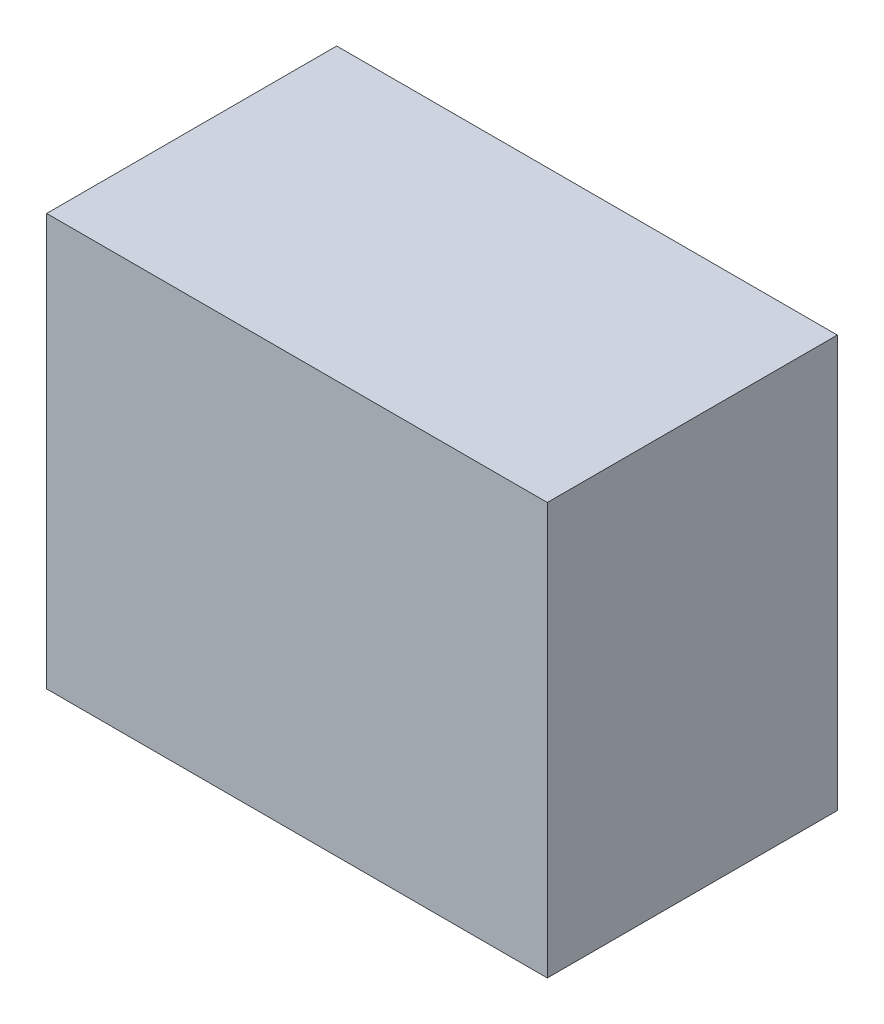
ISO-10303-21;
HEADER;
FILE_DESCRIPTION(('STEP AP214'),'2;1');
FILE_NAME('part.step','',(''),(''),'','','');
FILE_SCHEMA(('AUTOMOTIVE_DESIGN { 1 0 10303 214 1 1 1 1 }'));
ENDSEC;
DATA;
#1=APPLICATION_CONTEXT('core data for automotive mechanical design processes');
#2=APPLICATION_PROTOCOL_DEFINITION('international standard','automotive_design',2000,#1);
#3=PRODUCT_CONTEXT('',#1,'mechanical');
#4=PRODUCT('Part','Part','',(#3));
#5=PRODUCT_RELATED_PRODUCT_CATEGORY('part','',(#4));
#6=PRODUCT_DEFINITION_FORMATION('','',#4);
#7=PRODUCT_DEFINITION_CONTEXT('part definition',#1,'design');
#8=PRODUCT_DEFINITION('design','',#6,#7);
#9=PRODUCT_DEFINITION_SHAPE('','',#8);
#10=(LENGTH_UNIT() NAMED_UNIT(*) SI_UNIT(.MILLI.,.METRE.));
#11=(NAMED_UNIT(*) PLANE_ANGLE_UNIT() SI_UNIT($,.RADIAN.));
#12=(NAMED_UNIT(*) SI_UNIT($,.STERADIAN.) SOLID_ANGLE_UNIT());
#13=UNCERTAINTY_MEASURE_WITH_UNIT(LENGTH_MEASURE(1.E-05),#10,'distance_accuracy_value','');
#14=(GEOMETRIC_REPRESENTATION_CONTEXT(3) GLOBAL_UNCERTAINTY_ASSIGNED_CONTEXT((#13)) GLOBAL_UNIT_ASSIGNED_CONTEXT((#10,
#11,#12)) REPRESENTATION_CONTEXT('',''));
#15=CARTESIAN_POINT('',(0.,0.,0.));
#16=DIRECTION('',(0.,0.,1.));
#17=DIRECTION('',(1.,0.,0.));
#18=AXIS2_PLACEMENT_3D('',#15,#16,#17);
#19=CARTESIAN_POINT('',(0.,0.,6.35));
#20=DIRECTION('',(1.,0.,0.));
#21=DIRECTION('',(0.,1.,0.));
#22=AXIS2_PLACEMENT_3D('',#19,#20,#21);
#23=PLANE('',#22);
#24=CARTESIAN_POINT('',(0.,-6.35,0.));
#25=DIRECTION('',(-1.,0.,0.));
#26=DIRECTION('',(0.,-1.,0.));
#27=AXIS2_PLACEMENT_3D('',#24,#25,#26);
#28=CIRCLE('',#27,3.175);
#29=CARTESIAN_POINT('',(0.,-9.525,0.));
#30=VERTEX_POINT('',#29);
#31=EDGE_CURVE('E107',#30,#30,#28,.T.);
#32=ORIENTED_EDGE('',*,*,#31,.F.);
#33=EDGE_LOOP('',(#32));
#34=FACE_BOUND('',#33,.T.);
#35=DIRECTION('',(0.,-1.,0.));
#36=VECTOR('',#35,1.);
#37=CARTESIAN_POINT('',(0.,0.,-6.35));
#38=LINE('',#37,#36);
#39=CARTESIAN_POINT('',(0.,0.,-6.35));
#40=VERTEX_POINT('',#39);
#41=CARTESIAN_POINT('',(0.,-18.034,-6.35));
#42=VERTEX_POINT('',#41);
#43=EDGE_CURVE('E99',#40,#42,#38,.T.);
#44=ORIENTED_EDGE('',*,*,#43,.T.);
#45=DIRECTION('',(0.,0.,1.));
#46=VECTOR('',#45,1.);
#47=CARTESIAN_POINT('',(0.,-18.034,6.35));
#48=LINE('',#47,#46);
#49=CARTESIAN_POINT('',(0.,-18.034,6.35));
#50=VERTEX_POINT('',#49);
#51=EDGE_CURVE('E65',#42,#50,#48,.T.);
#52=ORIENTED_EDGE('',*,*,#51,.T.);
#53=DIRECTION('',(0.,-1.,0.));
#54=VECTOR('',#53,1.);
#55=CARTESIAN_POINT('',(0.,0.,6.35));
#56=LINE('',#55,#54);
#57=CARTESIAN_POINT('',(0.,0.,6.35));
#58=VERTEX_POINT('',#57);
#59=EDGE_CURVE('E94',#58,#50,#56,.T.);
#60=ORIENTED_EDGE('',*,*,#59,.F.);
#61=DIRECTION('',(0.,0.,-1.));
#62=VECTOR('',#61,1.);
#63=CARTESIAN_POINT('',(0.,0.,6.35));
#64=LINE('',#63,#62);
#65=EDGE_CURVE('E58',#58,#40,#64,.T.);
#66=ORIENTED_EDGE('',*,*,#65,.T.);
#67=EDGE_LOOP('',(#44,#52,#60,#66));
#68=FACE_BOUND('',#67,.T.);
#69=ADVANCED_FACE('F50',(#34,#68),#23,.F.);
#70=CARTESIAN_POINT('',(21.9241874454343,0.,6.35));
#71=DIRECTION('',(-1.,0.,0.));
#72=DIRECTION('',(0.,-1.,0.));
#73=AXIS2_PLACEMENT_3D('',#70,#71,#72);
#74=PLANE('',#73);
#75=DIRECTION('',(0.,1.,0.));
#76=VECTOR('',#75,1.);
#77=CARTESIAN_POINT('',(21.9241874454343,0.,6.35));
#78=LINE('',#77,#76);
#79=CARTESIAN_POINT('',(21.9241874454343,-18.034,6.35));
#80=VERTEX_POINT('',#79);
#81=CARTESIAN_POINT('',(21.9241874454343,0.,6.35));
#82=VERTEX_POINT('',#81);
#83=EDGE_CURVE('E111',#80,#82,#78,.T.);
#84=ORIENTED_EDGE('',*,*,#83,.F.);
#85=DIRECTION('',(0.,0.,1.));
#86=VECTOR('',#85,1.);
#87=CARTESIAN_POINT('',(21.9241874454343,-18.034,6.35));
#88=LINE('',#87,#86);
#89=CARTESIAN_POINT('',(21.9241874454343,-18.034,-6.35));
#90=VERTEX_POINT('',#89);
#91=EDGE_CURVE('E129',#90,#80,#88,.T.);
#92=ORIENTED_EDGE('',*,*,#91,.F.);
#93=DIRECTION('',(0.,1.,0.));
#94=VECTOR('',#93,1.);
#95=CARTESIAN_POINT('',(21.9241874454343,0.,-6.35));
#96=LINE('',#95,#94);
#97=CARTESIAN_POINT('',(21.9241874454343,0.,-6.35));
#98=VERTEX_POINT('',#97);
#99=EDGE_CURVE('E95',#90,#98,#96,.T.);
#100=ORIENTED_EDGE('',*,*,#99,.T.);
#101=DIRECTION('',(0.,0.,-1.));
#102=VECTOR('',#101,1.);
#103=CARTESIAN_POINT('',(21.9241874454343,0.,6.35));
#104=LINE('',#103,#102);
#105=EDGE_CURVE('E13',#82,#98,#104,.T.);
#106=ORIENTED_EDGE('',*,*,#105,.F.);
#107=EDGE_LOOP('',(#84,#92,#100,#106));
#108=FACE_BOUND('',#107,.T.);
#109=ADVANCED_FACE('F139',(#108),#74,.F.);
#110=CARTESIAN_POINT('',(0.,0.,6.35));
#111=DIRECTION('',(0.,-1.,0.));
#112=DIRECTION('',(0.,0.,-1.));
#113=AXIS2_PLACEMENT_3D('',#110,#111,#112);
#114=PLANE('',#113);
#115=DIRECTION('',(-1.,0.,0.));
#116=VECTOR('',#115,1.);
#117=CARTESIAN_POINT('',(0.,0.,-6.35));
#118=LINE('',#117,#116);
#119=EDGE_CURVE('E86',#98,#40,#118,.T.);
#120=ORIENTED_EDGE('',*,*,#119,.T.);
#121=ORIENTED_EDGE('',*,*,#65,.F.);
#122=DIRECTION('',(-1.,0.,0.));
#123=VECTOR('',#122,1.);
#124=CARTESIAN_POINT('',(0.,0.,6.35));
#125=LINE('',#124,#123);
#126=EDGE_CURVE('E74',#82,#58,#125,.T.);
#127=ORIENTED_EDGE('',*,*,#126,.F.);
#128=ORIENTED_EDGE('',*,*,#105,.T.);
#129=EDGE_LOOP('',(#120,#121,#127,#128));
#130=FACE_BOUND('',#129,.T.);
#131=ADVANCED_FACE('F88',(#130),#114,.F.);
#132=CARTESIAN_POINT('',(0.,0.,6.35));
#133=DIRECTION('',(0.,0.,1.));
#134=DIRECTION('',(1.,0.,0.));
#135=AXIS2_PLACEMENT_3D('',#132,#133,#134);
#136=PLANE('',#135);
#137=DIRECTION('',(1.,0.,0.));
#138=VECTOR('',#137,1.);
#139=CARTESIAN_POINT('',(0.,-18.034,6.35));
#140=LINE('',#139,#138);
#141=EDGE_CURVE('E126',#50,#80,#140,.T.);
#142=ORIENTED_EDGE('',*,*,#141,.T.);
#143=ORIENTED_EDGE('',*,*,#83,.T.);
#144=ORIENTED_EDGE('',*,*,#126,.T.);
#145=ORIENTED_EDGE('',*,*,#59,.T.);
#146=EDGE_LOOP('',(#142,#143,#144,#145));
#147=FACE_BOUND('',#146,.T.);
#148=ADVANCED_FACE('F134',(#147),#136,.T.);
#149=CARTESIAN_POINT('',(0.,0.,-6.35));
#150=DIRECTION('',(0.,0.,1.));
#151=DIRECTION('',(1.,0.,0.));
#152=AXIS2_PLACEMENT_3D('',#149,#150,#151);
#153=PLANE('',#152);
#154=CARTESIAN_POINT('',(15.5741874454343,-6.35,-6.35));
#155=DIRECTION('',(0.,0.,-1.));
#156=DIRECTION('',(-1.,0.,0.));
#157=AXIS2_PLACEMENT_3D('',#154,#155,#156);
#158=CIRCLE('',#157,3.175);
#159=CARTESIAN_POINT('',(12.3991874454343,-6.35,-6.35));
#160=VERTEX_POINT('',#159);
#161=EDGE_CURVE('E120',#160,#160,#158,.T.);
#162=ORIENTED_EDGE('',*,*,#161,.F.);
#163=EDGE_LOOP('',(#162));
#164=FACE_BOUND('',#163,.T.);
#165=ORIENTED_EDGE('',*,*,#99,.F.);
#166=DIRECTION('',(1.,0.,0.));
#167=VECTOR('',#166,1.);
#168=CARTESIAN_POINT('',(0.,-18.034,-6.35));
#169=LINE('',#168,#167);
#170=EDGE_CURVE('E102',#42,#90,#169,.T.);
#171=ORIENTED_EDGE('',*,*,#170,.F.);
#172=ORIENTED_EDGE('',*,*,#43,.F.);
#173=ORIENTED_EDGE('',*,*,#119,.F.);
#174=EDGE_LOOP('',(#165,#171,#172,#173));
#175=FACE_BOUND('',#174,.T.);
#176=ADVANCED_FACE('F101',(#164,#175),#153,.F.);
#177=CARTESIAN_POINT('',(9.525,-6.35,0.));
#178=DIRECTION('',(-1.,0.,0.));
#179=DIRECTION('',(0.,-1.,0.));
#180=AXIS2_PLACEMENT_3D('',#177,#178,#179);
#181=CYLINDRICAL_SURFACE('',#180,3.175);
#182=CARTESIAN_POINT('',(9.525,-6.35,0.));
#183=DIRECTION('',(-1.,0.,0.));
#184=DIRECTION('',(0.,-1.,0.));
#185=AXIS2_PLACEMENT_3D('',#182,#183,#184);
#186=CIRCLE('',#185,3.175);
#187=CARTESIAN_POINT('',(9.525,-9.525,0.));
#188=VERTEX_POINT('',#187);
#189=EDGE_CURVE('E103',#188,#188,#186,.T.);
#190=CARTESIAN_POINT('',(9.525,-9.525,0.));
#191=CARTESIAN_POINT('',(9.42578125,-9.525,0.));
#192=CARTESIAN_POINT('',(9.3265625,-9.525,0.));
#193=CARTESIAN_POINT('',(9.128125,-9.525,0.));
#194=CARTESIAN_POINT('',(9.02890625,-9.525,0.));
#195=CARTESIAN_POINT('',(8.83046875,-9.525,0.));
#196=CARTESIAN_POINT('',(8.73125,-9.525,0.));
#197=CARTESIAN_POINT('',(8.5328125,-9.525,0.));
#198=CARTESIAN_POINT('',(8.43359375,-9.525,0.));
#199=CARTESIAN_POINT('',(8.23515625,-9.525,0.));
#200=CARTESIAN_POINT('',(8.1359375,-9.525,0.));
#201=CARTESIAN_POINT('',(7.9375,-9.525,0.));
#202=CARTESIAN_POINT('',(7.83828125,-9.525,0.));
#203=CARTESIAN_POINT('',(7.63984375,-9.525,0.));
#204=CARTESIAN_POINT('',(7.540625,-9.525,0.));
#205=CARTESIAN_POINT('',(7.3421875,-9.525,0.));
#206=CARTESIAN_POINT('',(7.24296875,-9.525,0.));
#207=CARTESIAN_POINT('',(7.04453125,-9.525,0.));
#208=CARTESIAN_POINT('',(6.9453125,-9.525,0.));
#209=CARTESIAN_POINT('',(6.746875,-9.525,0.));
#210=CARTESIAN_POINT('',(6.64765625,-9.525,0.));
#211=CARTESIAN_POINT('',(6.44921875,-9.525,0.));
#212=CARTESIAN_POINT('',(6.35,-9.525,0.));
#213=CARTESIAN_POINT('',(6.1515625,-9.525,0.));
#214=CARTESIAN_POINT('',(6.05234375,-9.525,0.));
#215=CARTESIAN_POINT('',(5.85390625,-9.525,0.));
#216=CARTESIAN_POINT('',(5.7546875,-9.525,0.));
#217=CARTESIAN_POINT('',(5.55625,-9.525,0.));
#218=CARTESIAN_POINT('',(5.45703125,-9.525,0.));
#219=CARTESIAN_POINT('',(5.25859375,-9.525,0.));
#220=CARTESIAN_POINT('',(5.159375,-9.525,0.));
#221=CARTESIAN_POINT('',(4.9609375,-9.525,0.));
#222=CARTESIAN_POINT('',(4.86171875,-9.525,0.));
#223=CARTESIAN_POINT('',(4.66328125,-9.525,0.));
#224=CARTESIAN_POINT('',(4.5640625,-9.525,0.));
#225=CARTESIAN_POINT('',(4.365625,-9.525,0.));
#226=CARTESIAN_POINT('',(4.26640625,-9.525,0.));
#227=CARTESIAN_POINT('',(4.06796875,-9.525,0.));
#228=CARTESIAN_POINT('',(3.96875,-9.525,0.));
#229=CARTESIAN_POINT('',(3.7703125,-9.525,0.));
#230=CARTESIAN_POINT('',(3.67109375,-9.525,0.));
#231=CARTESIAN_POINT('',(3.47265625,-9.525,0.));
#232=CARTESIAN_POINT('',(3.3734375,-9.525,0.));
#233=CARTESIAN_POINT('',(3.175,-9.525,0.));
#234=CARTESIAN_POINT('',(3.07578125,-9.525,0.));
#235=CARTESIAN_POINT('',(2.87734375,-9.525,0.));
#236=CARTESIAN_POINT('',(2.778125,-9.525,0.));
#237=CARTESIAN_POINT('',(2.5796875,-9.525,0.));
#238=CARTESIAN_POINT('',(2.48046875,-9.525,0.));
#239=CARTESIAN_POINT('',(2.28203125,-9.525,0.));
#240=CARTESIAN_POINT('',(2.1828125,-9.525,0.));
#241=CARTESIAN_POINT('',(1.984375,-9.525,0.));
#242=CARTESIAN_POINT('',(1.88515625,-9.525,0.));
#243=CARTESIAN_POINT('',(1.68671875,-9.525,0.));
#244=CARTESIAN_POINT('',(1.5875,-9.525,0.));
#245=CARTESIAN_POINT('',(1.3890625,-9.525,0.));
#246=CARTESIAN_POINT('',(1.28984375,-9.525,0.));
#247=CARTESIAN_POINT('',(1.09140625,-9.525,0.));
#248=CARTESIAN_POINT('',(0.992187500000001,-9.525,0.));
#249=CARTESIAN_POINT('',(0.793750000000001,-9.525,0.));
#250=CARTESIAN_POINT('',(0.69453125,-9.525,0.));
#251=CARTESIAN_POINT('',(0.49609375,-9.525,0.));
#252=CARTESIAN_POINT('',(0.396875,-9.525,0.));
#253=CARTESIAN_POINT('',(0.1984375,-9.525,0.));
#254=CARTESIAN_POINT('',(0.0992187500000001,-9.525,0.));
#255=CARTESIAN_POINT('',(0.,-9.525,0.));
#256=B_SPLINE_CURVE_WITH_KNOTS('',3,(#190,#191,#192,#193,#194,#195,#196,#197,#198,#199,#200,
#201,#202,#203,#204,#205,#206,#207,#208,#209,#210,#211,#212,#213,#214,#215,#216,#217,#218,#219,
#220,#221,#222,#223,#224,#225,#226,#227,#228,#229,#230,#231,#232,#233,#234,#235,#236,#237,#238,
#239,#240,#241,#242,#243,#244,#245,#246,#247,#248,#249,#250,#251,#252,#253,#254,#255),
.UNSPECIFIED.,.F.,.F.,(4,2,2,2,2,2,2,2,2,2,2,2,2,2,2,2,2,2,2,2,2,2,2,2,2,2,2,2,2,2,2,2,4),(0.,
0.297656249999998,0.595312499999999,0.892968749999999,1.190625,1.48828125,1.7859375,2.08359375,
2.38125,2.67890625,2.9765625,3.27421875,3.571875,3.86953125,4.1671875,4.46484375,4.7625,
5.06015625,5.3578125,5.65546875,5.953125,6.25078125,6.5484375,6.84609375,7.14375,7.44140625,
7.7390625,8.03671875,8.334375,8.63203125,8.9296875,9.22734375,9.525),.UNSPECIFIED.);
#257=EDGE_CURVE('BSEAM166',#188,#30,#256,.T.);
#258=ORIENTED_EDGE('',*,*,#189,.F.);
#259=ORIENTED_EDGE('',*,*,#31,.T.);
#260=ORIENTED_EDGE('',*,*,#257,.T.);
#261=ORIENTED_EDGE('',*,*,#257,.F.);
#262=EDGE_LOOP('',(#258,#260,#259,#261));
#263=FACE_BOUND('',#262,.T.);
#264=ADVANCED_FACE('F166',(#263),#181,.F.);
#265=CARTESIAN_POINT('',(9.525,-6.35,0.));
#266=DIRECTION('',(-1.,0.,0.));
#267=DIRECTION('',(0.,-1.,0.));
#268=AXIS2_PLACEMENT_3D('',#265,#266,#267);
#269=PLANE('',#268);
#270=ORIENTED_EDGE('',*,*,#189,.T.);
#271=EDGE_LOOP('',(#270));
#272=FACE_BOUND('',#271,.T.);
#273=ADVANCED_FACE('F168',(#272),#269,.T.);
#274=CARTESIAN_POINT('',(15.5741874454343,-6.35,3.175));
#275=DIRECTION('',(0.,0.,-1.));
#276=DIRECTION('',(-1.,0.,0.));
#277=AXIS2_PLACEMENT_3D('',#274,#275,#276);
#278=CYLINDRICAL_SURFACE('',#277,3.175);
#279=CARTESIAN_POINT('',(15.5741874454343,-6.35,3.175));
#280=DIRECTION('',(0.,0.,-1.));
#281=DIRECTION('',(-1.,0.,0.));
#282=AXIS2_PLACEMENT_3D('',#279,#280,#281);
#283=CIRCLE('',#282,3.175);
#284=CARTESIAN_POINT('',(12.3991874454343,-6.35,3.175));
#285=VERTEX_POINT('',#284);
#286=EDGE_CURVE('E119',#285,#285,#283,.T.);
#287=CARTESIAN_POINT('',(12.3991874454343,-6.35,3.175));
#288=CARTESIAN_POINT('',(12.3991874454343,-6.35,3.07578125));
#289=CARTESIAN_POINT('',(12.3991874454343,-6.35,2.9765625));
#290=CARTESIAN_POINT('',(12.3991874454343,-6.35,2.778125));
#291=CARTESIAN_POINT('',(12.3991874454343,-6.35,2.67890625));
#292=CARTESIAN_POINT('',(12.3991874454343,-6.35,2.48046875));
#293=CARTESIAN_POINT('',(12.3991874454343,-6.35,2.38125));
#294=CARTESIAN_POINT('',(12.3991874454343,-6.35,2.1828125));
#295=CARTESIAN_POINT('',(12.3991874454343,-6.35,2.08359375));
#296=CARTESIAN_POINT('',(12.3991874454343,-6.35,1.88515625));
#297=CARTESIAN_POINT('',(12.3991874454343,-6.35,1.7859375));
#298=CARTESIAN_POINT('',(12.3991874454343,-6.35,1.5875));
#299=CARTESIAN_POINT('',(12.3991874454343,-6.35,1.48828125));
#300=CARTESIAN_POINT('',(12.3991874454343,-6.35,1.28984375));
#301=CARTESIAN_POINT('',(12.3991874454343,-6.35,1.190625));
#302=CARTESIAN_POINT('',(12.3991874454343,-6.35,0.992187500000001));
#303=CARTESIAN_POINT('',(12.3991874454343,-6.35,0.892968750000001));
#304=CARTESIAN_POINT('',(12.3991874454343,-6.35,0.694531250000001));
#305=CARTESIAN_POINT('',(12.3991874454343,-6.35,0.5953125));
#306=CARTESIAN_POINT('',(12.3991874454343,-6.35,0.396875));
#307=CARTESIAN_POINT('',(12.3991874454343,-6.35,0.29765625));
#308=CARTESIAN_POINT('',(12.3991874454343,-6.35,0.0992187500000004));
#309=CARTESIAN_POINT('',(12.3991874454343,-6.35,0.));
#310=CARTESIAN_POINT('',(12.3991874454343,-6.35,-0.1984375));
#311=CARTESIAN_POINT('',(12.3991874454343,-6.35,-0.29765625));
#312=CARTESIAN_POINT('',(12.3991874454343,-6.35,-0.49609375));
#313=CARTESIAN_POINT('',(12.3991874454343,-6.35,-0.5953125));
#314=CARTESIAN_POINT('',(12.3991874454343,-6.35,-0.79375));
#315=CARTESIAN_POINT('',(12.3991874454343,-6.35,-0.892968749999999));
#316=CARTESIAN_POINT('',(12.3991874454343,-6.35,-1.09140625));
#317=CARTESIAN_POINT('',(12.3991874454343,-6.35,-1.190625));
#318=CARTESIAN_POINT('',(12.3991874454343,-6.35,-1.3890625));
#319=CARTESIAN_POINT('',(12.3991874454343,-6.35,-1.48828125));
#320=CARTESIAN_POINT('',(12.3991874454343,-6.35,-1.68671875));
#321=CARTESIAN_POINT('',(12.3991874454343,-6.35,-1.7859375));
#322=CARTESIAN_POINT('',(12.3991874454343,-6.35,-1.984375));
#323=CARTESIAN_POINT('',(12.3991874454343,-6.35,-2.08359375));
#324=CARTESIAN_POINT('',(12.3991874454343,-6.35,-2.28203125));
#325=CARTESIAN_POINT('',(12.3991874454343,-6.35,-2.38125));
#326=CARTESIAN_POINT('',(12.3991874454343,-6.35,-2.5796875));
#327=CARTESIAN_POINT('',(12.3991874454343,-6.35,-2.67890625));
#328=CARTESIAN_POINT('',(12.3991874454343,-6.35,-2.87734375));
#329=CARTESIAN_POINT('',(12.3991874454343,-6.35,-2.9765625));
#330=CARTESIAN_POINT('',(12.3991874454343,-6.35,-3.175));
#331=CARTESIAN_POINT('',(12.3991874454343,-6.35,-3.27421875));
#332=CARTESIAN_POINT('',(12.3991874454343,-6.35,-3.47265625));
#333=CARTESIAN_POINT('',(12.3991874454343,-6.35,-3.571875));
#334=CARTESIAN_POINT('',(12.3991874454343,-6.35,-3.7703125));
#335=CARTESIAN_POINT('',(12.3991874454343,-6.35,-3.86953125));
#336=CARTESIAN_POINT('',(12.3991874454343,-6.35,-4.06796875));
#337=CARTESIAN_POINT('',(12.3991874454343,-6.35,-4.1671875));
#338=CARTESIAN_POINT('',(12.3991874454343,-6.35,-4.365625));
#339=CARTESIAN_POINT('',(12.3991874454343,-6.35,-4.46484375));
#340=CARTESIAN_POINT('',(12.3991874454343,-6.35,-4.66328125));
#341=CARTESIAN_POINT('',(12.3991874454343,-6.35,-4.7625));
#342=CARTESIAN_POINT('',(12.3991874454343,-6.35,-4.9609375));
#343=CARTESIAN_POINT('',(12.3991874454343,-6.35,-5.06015625));
#344=CARTESIAN_POINT('',(12.3991874454343,-6.35,-5.25859375));
#345=CARTESIAN_POINT('',(12.3991874454343,-6.35,-5.3578125));
#346=CARTESIAN_POINT('',(12.3991874454343,-6.35,-5.55625));
#347=CARTESIAN_POINT('',(12.3991874454343,-6.35,-5.65546875));
#348=CARTESIAN_POINT('',(12.3991874454343,-6.35,-5.85390625));
#349=CARTESIAN_POINT('',(12.3991874454343,-6.35,-5.953125));
#350=CARTESIAN_POINT('',(12.3991874454343,-6.35,-6.1515625));
#351=CARTESIAN_POINT('',(12.3991874454343,-6.35,-6.25078125));
#352=CARTESIAN_POINT('',(12.3991874454343,-6.35,-6.35));
#353=B_SPLINE_CURVE_WITH_KNOTS('',3,(#287,#288,#289,#290,#291,#292,#293,#294,#295,#296,#297,
#298,#299,#300,#301,#302,#303,#304,#305,#306,#307,#308,#309,#310,#311,#312,#313,#314,#315,#316,
#317,#318,#319,#320,#321,#322,#323,#324,#325,#326,#327,#328,#329,#330,#331,#332,#333,#334,#335,
#336,#337,#338,#339,#340,#341,#342,#343,#344,#345,#346,#347,#348,#349,#350,#351,#352),
.UNSPECIFIED.,.F.,.F.,(4,2,2,2,2,2,2,2,2,2,2,2,2,2,2,2,2,2,2,2,2,2,2,2,2,2,2,2,2,2,2,2,4),(0.,
0.29765625,0.5953125,0.89296875,1.190625,1.48828125,1.7859375,2.08359375,2.38125,2.67890625,
2.9765625,3.27421875,3.571875,3.86953125,4.1671875,4.46484375,4.7625,5.06015625,5.3578125,
5.65546875,5.953125,6.25078125,6.5484375,6.84609375,7.14375,7.44140625,7.7390625,8.03671875,
8.334375,8.63203125,8.9296875,9.22734375,9.525),.UNSPECIFIED.);
#354=EDGE_CURVE('BSEAM154',#285,#160,#353,.T.);
#355=ORIENTED_EDGE('',*,*,#286,.F.);
#356=ORIENTED_EDGE('',*,*,#161,.T.);
#357=ORIENTED_EDGE('',*,*,#354,.T.);
#358=ORIENTED_EDGE('',*,*,#354,.F.);
#359=EDGE_LOOP('',(#355,#357,#356,#358));
#360=FACE_BOUND('',#359,.T.);
#361=ADVANCED_FACE('F154',(#360),#278,.F.);
#362=CARTESIAN_POINT('',(15.5741874454343,-6.35,3.175));
#363=DIRECTION('',(0.,0.,-1.));
#364=DIRECTION('',(-1.,0.,0.));
#365=AXIS2_PLACEMENT_3D('',#362,#363,#364);
#366=PLANE('',#365);
#367=ORIENTED_EDGE('',*,*,#286,.T.);
#368=EDGE_LOOP('',(#367));
#369=FACE_BOUND('',#368,.T.);
#370=ADVANCED_FACE('F144',(#369),#366,.T.);
#371=CARTESIAN_POINT('',(0.,-18.034,6.35));
#372=DIRECTION('',(0.,1.,0.));
#373=DIRECTION('',(-1.,0.,0.));
#374=AXIS2_PLACEMENT_3D('',#371,#372,#373);
#375=PLANE('',#374);
#376=CARTESIAN_POINT('',(8.82842690022267,-18.034,0.));
#377=DIRECTION('',(0.,1.,0.));
#378=DIRECTION('',(1.,0.,0.));
#379=AXIS2_PLACEMENT_3D('',#376,#377,#378);
#380=ELLIPSE('',#379,3.66617420935412,3.175);
#381=CARTESIAN_POINT('',(12.4946011095768,-18.034,0.));
#382=VERTEX_POINT('',#381);
#383=EDGE_CURVE('E53',#382,#382,#380,.T.);
#384=ORIENTED_EDGE('',*,*,#383,.T.);
#385=EDGE_LOOP('',(#384));
#386=FACE_BOUND('',#385,.T.);
#387=ORIENTED_EDGE('',*,*,#91,.T.);
#388=ORIENTED_EDGE('',*,*,#141,.F.);
#389=ORIENTED_EDGE('',*,*,#51,.F.);
#390=ORIENTED_EDGE('',*,*,#170,.T.);
#391=EDGE_LOOP('',(#387,#388,#389,#390));
#392=FACE_BOUND('',#391,.T.);
#393=ADVANCED_FACE('F141',(#386,#392),#375,.F.);
#394=CARTESIAN_POINT('',(12.5495937227171,-11.58875,0.));
#395=DIRECTION('',(-0.500000000000001,-0.866025403784438,0.));
#396=DIRECTION('',(0.866025403784438,-0.500000000000001,0.));
#397=AXIS2_PLACEMENT_3D('',#394,#395,#396);
#398=PLANE('',#397);
#399=CARTESIAN_POINT('',(12.5495937227171,-11.58875,0.));
#400=DIRECTION('',(-0.500000000000001,-0.866025403784438,0.));
#401=DIRECTION('',(0.866025403784438,-0.500000000000001,0.));
#402=AXIS2_PLACEMENT_3D('',#399,#400,#401);
#403=CIRCLE('',#402,3.175);
#404=CARTESIAN_POINT('',(15.2992243797327,-13.17625,0.));
#405=VERTEX_POINT('',#404);
#406=EDGE_CURVE('E115',#405,#405,#403,.T.);
#407=ORIENTED_EDGE('',*,*,#406,.T.);
#408=EDGE_LOOP('',(#407));
#409=FACE_BOUND('',#408,.T.);
#410=ADVANCED_FACE('F143',(#409),#398,.T.);
#411=CARTESIAN_POINT('',(5.83963727933593,-23.2107354765103,0.));
#412=DIRECTION('',(0.500000000000001,0.866025403784438,0.));
#413=DIRECTION('',(-0.866025403784438,0.500000000000001,0.));
#414=AXIS2_PLACEMENT_3D('',#411,#412,#413);
#415=CYLINDRICAL_SURFACE('',#414,3.175);
#416=ORIENTED_EDGE('',*,*,#383,.F.);
#417=EDGE_LOOP('',(#416));
#418=FACE_BOUND('',#417,.T.);
#419=ORIENTED_EDGE('',*,*,#406,.F.);
#420=EDGE_LOOP('',(#419));
#421=FACE_BOUND('',#420,.T.);
#422=ADVANCED_FACE('F151',(#418,#421),#415,.F.);
#423=CLOSED_SHELL('',(#69,#109,#131,#148,#176,#264,#273,#361,#370,#393,#410,#422));
#424=MANIFOLD_SOLID_BREP('B2',#423);
#425=ADVANCED_BREP_SHAPE_REPRESENTATION('',(#18,#424),#14);
#426=SHAPE_DEFINITION_REPRESENTATION(#9,#425);
ENDSEC;
END-ISO-10303-21;
